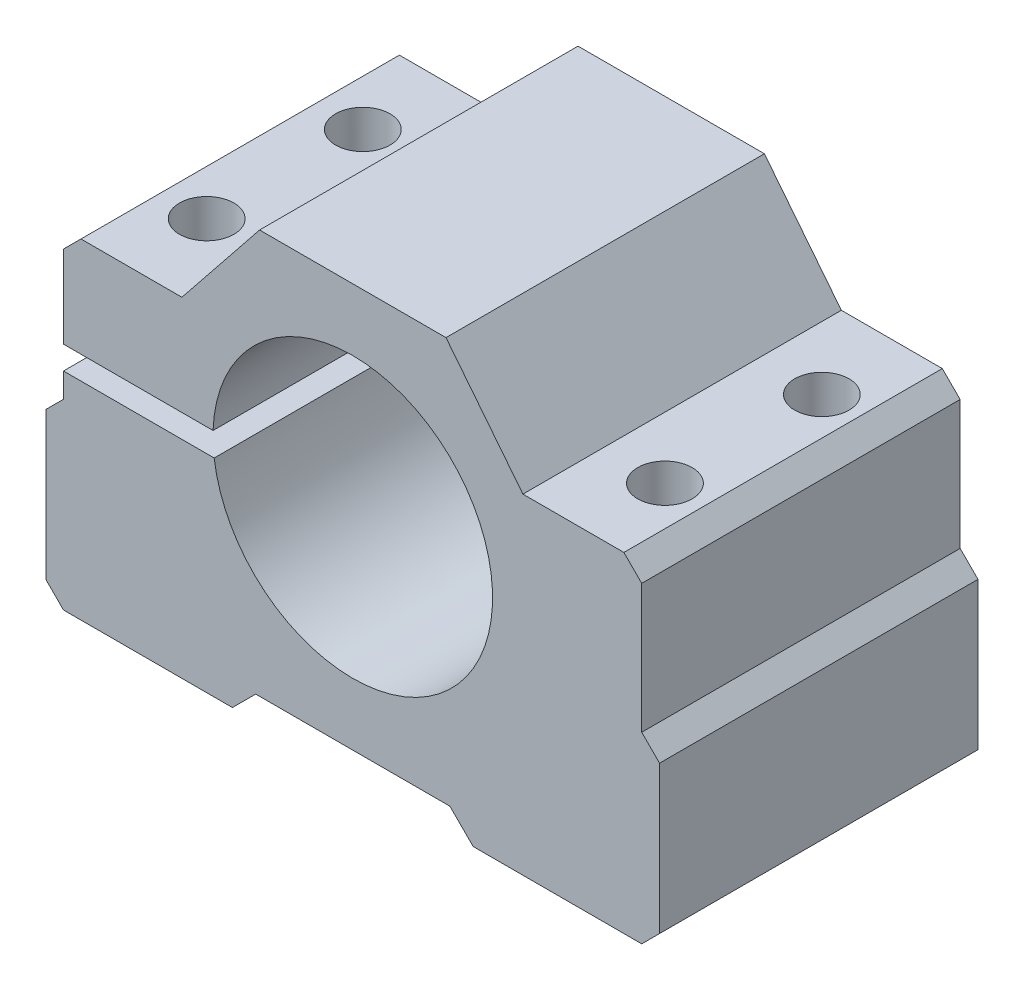
ISO-10303-21;
HEADER;
FILE_DESCRIPTION(('STEP AP214'),'2;1');
FILE_NAME('part.step','',(''),(''),'','','');
FILE_SCHEMA(('AUTOMOTIVE_DESIGN { 1 0 10303 214 1 1 1 1 }'));
ENDSEC;
DATA;
#1=APPLICATION_CONTEXT('core data for automotive mechanical design processes');
#2=APPLICATION_PROTOCOL_DEFINITION('international standard','automotive_design',2000,#1);
#3=PRODUCT_CONTEXT('',#1,'mechanical');
#4=PRODUCT('Part','Part','',(#3));
#5=PRODUCT_RELATED_PRODUCT_CATEGORY('part','',(#4));
#6=PRODUCT_DEFINITION_FORMATION('','',#4);
#7=PRODUCT_DEFINITION_CONTEXT('part definition',#1,'design');
#8=PRODUCT_DEFINITION('design','',#6,#7);
#9=PRODUCT_DEFINITION_SHAPE('','',#8);
#10=(LENGTH_UNIT() NAMED_UNIT(*) SI_UNIT(.MILLI.,.METRE.));
#11=(NAMED_UNIT(*) PLANE_ANGLE_UNIT() SI_UNIT($,.RADIAN.));
#12=(NAMED_UNIT(*) SI_UNIT($,.STERADIAN.) SOLID_ANGLE_UNIT());
#13=UNCERTAINTY_MEASURE_WITH_UNIT(LENGTH_MEASURE(1.E-05),#10,'distance_accuracy_value','');
#14=(GEOMETRIC_REPRESENTATION_CONTEXT(3) GLOBAL_UNCERTAINTY_ASSIGNED_CONTEXT((#13)) GLOBAL_UNIT_ASSIGNED_CONTEXT((#10,
#11,#12)) REPRESENTATION_CONTEXT('',''));
#15=CARTESIAN_POINT('',(0.,0.,0.));
#16=DIRECTION('',(0.,0.,1.));
#17=DIRECTION('',(1.,0.,0.));
#18=AXIS2_PLACEMENT_3D('',#15,#16,#17);
#19=CARTESIAN_POINT('',(39.5000000000198,29.,41.));
#20=DIRECTION('',(0.,0.,-1.));
#21=DIRECTION('',(-1.,0.,0.));
#22=AXIS2_PLACEMENT_3D('',#19,#20,#21);
#23=CYLINDRICAL_SURFACE('',#22,18.);
#24=CARTESIAN_POINT('',(39.5000000000198,29.,0.));
#25=DIRECTION('',(0.,0.,1.));
#26=DIRECTION('',(1.,0.,0.));
#27=AXIS2_PLACEMENT_3D('',#24,#25,#26);
#28=CIRCLE('',#27,18.);
#29=CARTESIAN_POINT('',(21.6537561687559,26.6523243164622,0.));
#30=VERTEX_POINT('',#29);
#31=CARTESIAN_POINT('',(21.5116217852036,29.646721888238,0.));
#32=VERTEX_POINT('',#31);
#33=EDGE_CURVE('E239',#30,#32,#28,.T.);
#34=ORIENTED_EDGE('',*,*,#33,.F.);
#35=DIRECTION('',(0.,0.,-1.));
#36=VECTOR('',#35,1.);
#37=CARTESIAN_POINT('',(21.6537561687559,26.6523243164622,41.));
#38=LINE('',#37,#36);
#39=CARTESIAN_POINT('',(21.6537561687559,26.6523243164622,41.));
#40=VERTEX_POINT('',#39);
#41=EDGE_CURVE('E11',#40,#30,#38,.T.);
#42=ORIENTED_EDGE('',*,*,#41,.F.);
#43=CARTESIAN_POINT('',(39.5000000000198,29.,41.));
#44=DIRECTION('',(0.,0.,1.));
#45=DIRECTION('',(1.,0.,0.));
#46=AXIS2_PLACEMENT_3D('',#43,#44,#45);
#47=CIRCLE('',#46,18.);
#48=CARTESIAN_POINT('',(21.5116217852036,29.646721888238,41.));
#49=VERTEX_POINT('',#48);
#50=EDGE_CURVE('E322',#40,#49,#47,.T.);
#51=ORIENTED_EDGE('',*,*,#50,.T.);
#52=DIRECTION('',(0.,0.,-1.));
#53=VECTOR('',#52,1.);
#54=CARTESIAN_POINT('',(21.5116217852036,29.646721888238,41.));
#55=LINE('',#54,#53);
#56=EDGE_CURVE('E145',#49,#32,#55,.T.);
#57=ORIENTED_EDGE('',*,*,#56,.T.);
#58=EDGE_LOOP('',(#34,#42,#51,#57));
#59=FACE_BOUND('',#58,.T.);
#60=ADVANCED_FACE('F43',(#59),#23,.F.);
#61=CARTESIAN_POINT('',(0.,26.6523243164623,41.));
#62=DIRECTION('',(0.,-1.,0.));
#63=DIRECTION('',(1.,0.,0.));
#64=AXIS2_PLACEMENT_3D('',#61,#62,#63);
#65=PLANE('',#64);
#66=CARTESIAN_POINT('',(10.4352501240759,26.6523243164622,10.642382920252));
#67=DIRECTION('',(0.,-1.,0.));
#68=DIRECTION('',(1.,0.,0.));
#69=AXIS2_PLACEMENT_3D('',#66,#67,#68);
#70=CIRCLE('',#69,3.50000000000001);
#71=CARTESIAN_POINT('',(13.9352501240759,26.6523243164622,10.642382920252));
#72=VERTEX_POINT('',#71);
#73=EDGE_CURVE('E406',#72,#72,#70,.T.);
#74=ORIENTED_EDGE('',*,*,#73,.T.);
#75=EDGE_LOOP('',(#74));
#76=FACE_BOUND('',#75,.T.);
#77=CARTESIAN_POINT('',(10.331990941298,26.6523243164622,30.642382920252));
#78=DIRECTION('',(0.,-1.,0.));
#79=DIRECTION('',(1.,0.,0.));
#80=AXIS2_PLACEMENT_3D('',#77,#78,#79);
#81=CIRCLE('',#80,3.50000000000001);
#82=CARTESIAN_POINT('',(13.831990941298,26.6523243164622,30.642382920252));
#83=VERTEX_POINT('',#82);
#84=EDGE_CURVE('E402',#83,#83,#81,.T.);
#85=ORIENTED_EDGE('',*,*,#84,.T.);
#86=EDGE_LOOP('',(#85));
#87=FACE_BOUND('',#86,.T.);
#88=DIRECTION('',(-1.,0.,0.));
#89=VECTOR('',#88,1.);
#90=CARTESIAN_POINT('',(0.,26.6523243164623,0.));
#91=LINE('',#90,#89);
#92=CARTESIAN_POINT('',(2.25017469417766,26.6523243164623,0.));
#93=VERTEX_POINT('',#92);
#94=EDGE_CURVE('E243',#30,#93,#91,.T.);
#95=ORIENTED_EDGE('',*,*,#94,.T.);
#96=DIRECTION('',(0.,0.,-1.));
#97=VECTOR('',#96,1.);
#98=CARTESIAN_POINT('',(2.25017469417766,26.6523243164623,41.));
#99=LINE('',#98,#97);
#100=CARTESIAN_POINT('',(2.25017469417766,26.6523243164623,41.));
#101=VERTEX_POINT('',#100);
#102=EDGE_CURVE('E53',#101,#93,#99,.T.);
#103=ORIENTED_EDGE('',*,*,#102,.F.);
#104=DIRECTION('',(-1.,0.,0.));
#105=VECTOR('',#104,1.);
#106=CARTESIAN_POINT('',(0.,26.6523243164623,41.));
#107=LINE('',#106,#105);
#108=EDGE_CURVE('E423',#40,#101,#107,.T.);
#109=ORIENTED_EDGE('',*,*,#108,.F.);
#110=ORIENTED_EDGE('',*,*,#41,.T.);
#111=EDGE_LOOP('',(#95,#103,#109,#110));
#112=FACE_BOUND('',#111,.T.);
#113=ADVANCED_FACE('F509',(#76,#87,#112),#65,.F.);
#114=CARTESIAN_POINT('',(2.25017469426138,7.06790387770834E-12,41.));
#115=DIRECTION('',(-1.,-3.14104673549731E-12,0.));
#116=DIRECTION('',(3.14104673549731E-12,-1.,0.));
#117=AXIS2_PLACEMENT_3D('',#114,#115,#116);
#118=PLANE('',#117);
#119=DIRECTION('',(-3.14104673549731E-12,1.,0.));
#120=VECTOR('',#119,1.);
#121=CARTESIAN_POINT('',(2.25017469426138,7.06790387770834E-12,0.));
#122=LINE('',#121,#120);
#123=CARTESIAN_POINT('',(2.25017469418756,23.5003493883652,0.));
#124=VERTEX_POINT('',#123);
#125=EDGE_CURVE('E247',#124,#93,#122,.T.);
#126=ORIENTED_EDGE('',*,*,#125,.F.);
#127=DIRECTION('',(0.,0.,-1.));
#128=VECTOR('',#127,1.);
#129=CARTESIAN_POINT('',(2.25017469418756,23.5003493883652,41.));
#130=LINE('',#129,#128);
#131=CARTESIAN_POINT('',(2.25017469418756,23.5003493883652,41.));
#132=VERTEX_POINT('',#131);
#133=EDGE_CURVE('E387',#132,#124,#130,.T.);
#134=ORIENTED_EDGE('',*,*,#133,.F.);
#135=DIRECTION('',(-3.14104673549731E-12,1.,0.));
#136=VECTOR('',#135,1.);
#137=CARTESIAN_POINT('',(2.25017469426138,7.06790387770834E-12,41.));
#138=LINE('',#137,#136);
#139=EDGE_CURVE('E426',#132,#101,#138,.T.);
#140=ORIENTED_EDGE('',*,*,#139,.T.);
#141=ORIENTED_EDGE('',*,*,#102,.T.);
#142=EDGE_LOOP('',(#126,#134,#140,#141));
#143=FACE_BOUND('',#142,.T.);
#144=ADVANCED_FACE('F512',(#143),#118,.T.);
#145=CARTESIAN_POINT('',(-10.6250873470888,10.6250873470888,41.));
#146=DIRECTION('',(-0.707106781186548,0.707106781186547,0.));
#147=DIRECTION('',(-0.707106781186547,-0.707106781186548,0.));
#148=AXIS2_PLACEMENT_3D('',#145,#146,#147);
#149=PLANE('',#148);
#150=DIRECTION('',(0.707106781186547,0.707106781186548,0.));
#151=VECTOR('',#150,1.);
#152=CARTESIAN_POINT('',(-10.6250873470888,10.6250873470888,0.));
#153=LINE('',#152,#151);
#154=CARTESIAN_POINT('',(0.,21.2501746941776,0.));
#155=VERTEX_POINT('',#154);
#156=EDGE_CURVE('E251',#155,#124,#153,.T.);
#157=ORIENTED_EDGE('',*,*,#156,.F.);
#158=DIRECTION('',(0.,0.,-1.));
#159=VECTOR('',#158,1.);
#160=CARTESIAN_POINT('',(0.,21.2501746941776,41.));
#161=LINE('',#160,#159);
#162=CARTESIAN_POINT('',(0.,21.2501746941776,41.));
#163=VERTEX_POINT('',#162);
#164=EDGE_CURVE('E384',#163,#155,#161,.T.);
#165=ORIENTED_EDGE('',*,*,#164,.F.);
#166=DIRECTION('',(0.707106781186547,0.707106781186548,0.));
#167=VECTOR('',#166,1.);
#168=CARTESIAN_POINT('',(-10.6250873470888,10.6250873470888,41.));
#169=LINE('',#168,#167);
#170=EDGE_CURVE('E430',#163,#132,#169,.T.);
#171=ORIENTED_EDGE('',*,*,#170,.T.);
#172=ORIENTED_EDGE('',*,*,#133,.T.);
#173=EDGE_LOOP('',(#157,#165,#171,#172));
#174=FACE_BOUND('',#173,.T.);
#175=ADVANCED_FACE('F515',(#174),#149,.T.);
#176=CARTESIAN_POINT('',(0.,0.,41.));
#177=DIRECTION('',(-1.,0.,0.));
#178=DIRECTION('',(0.,-1.,0.));
#179=AXIS2_PLACEMENT_3D('',#176,#177,#178);
#180=PLANE('',#179);
#181=DIRECTION('',(0.,1.,0.));
#182=VECTOR('',#181,1.);
#183=CARTESIAN_POINT('',(0.,0.,0.));
#184=LINE('',#183,#182);
#185=CARTESIAN_POINT('',(0.,2.25017469417764,0.));
#186=VERTEX_POINT('',#185);
#187=EDGE_CURVE('E255',#186,#155,#184,.T.);
#188=ORIENTED_EDGE('',*,*,#187,.F.);
#189=DIRECTION('',(0.,0.,-1.));
#190=VECTOR('',#189,1.);
#191=CARTESIAN_POINT('',(0.,2.25017469417764,41.));
#192=LINE('',#191,#190);
#193=CARTESIAN_POINT('',(0.,2.25017469417764,41.));
#194=VERTEX_POINT('',#193);
#195=EDGE_CURVE('E381',#194,#186,#192,.T.);
#196=ORIENTED_EDGE('',*,*,#195,.F.);
#197=DIRECTION('',(0.,1.,0.));
#198=VECTOR('',#197,1.);
#199=CARTESIAN_POINT('',(0.,0.,41.));
#200=LINE('',#199,#198);
#201=EDGE_CURVE('E434',#194,#163,#200,.T.);
#202=ORIENTED_EDGE('',*,*,#201,.T.);
#203=ORIENTED_EDGE('',*,*,#164,.T.);
#204=EDGE_LOOP('',(#188,#196,#202,#203));
#205=FACE_BOUND('',#204,.T.);
#206=ADVANCED_FACE('F520',(#205),#180,.T.);
#207=CARTESIAN_POINT('',(1.12508734708882,1.12508734708883,41.));
#208=DIRECTION('',(-0.707106781186544,-0.707106781186551,0.));
#209=DIRECTION('',(0.707106781186551,-0.707106781186544,0.));
#210=AXIS2_PLACEMENT_3D('',#207,#208,#209);
#211=PLANE('',#210);
#212=DIRECTION('',(-0.707106781186551,0.707106781186544,0.));
#213=VECTOR('',#212,1.);
#214=CARTESIAN_POINT('',(1.12508734708882,1.12508734708883,0.));
#215=LINE('',#214,#213);
#216=CARTESIAN_POINT('',(2.25017469417766,0.,0.));
#217=VERTEX_POINT('',#216);
#218=EDGE_CURVE('E259',#217,#186,#215,.T.);
#219=ORIENTED_EDGE('',*,*,#218,.F.);
#220=DIRECTION('',(0.,0.,-1.));
#221=VECTOR('',#220,1.);
#222=CARTESIAN_POINT('',(2.25017469417766,0.,41.));
#223=LINE('',#222,#221);
#224=CARTESIAN_POINT('',(2.25017469417766,0.,41.));
#225=VERTEX_POINT('',#224);
#226=EDGE_CURVE('E378',#225,#217,#223,.T.);
#227=ORIENTED_EDGE('',*,*,#226,.F.);
#228=DIRECTION('',(-0.707106781186551,0.707106781186544,0.));
#229=VECTOR('',#228,1.);
#230=CARTESIAN_POINT('',(1.12508734708882,1.12508734708883,41.));
#231=LINE('',#230,#229);
#232=EDGE_CURVE('E438',#225,#194,#231,.T.);
#233=ORIENTED_EDGE('',*,*,#232,.T.);
#234=ORIENTED_EDGE('',*,*,#195,.T.);
#235=EDGE_LOOP('',(#219,#227,#233,#234));
#236=FACE_BOUND('',#235,.T.);
#237=ADVANCED_FACE('F523',(#236),#211,.T.);
#238=CARTESIAN_POINT('',(0.,0.,41.));
#239=DIRECTION('',(0.,1.,0.));
#240=DIRECTION('',(0.,0.,1.));
#241=AXIS2_PLACEMENT_3D('',#238,#239,#240);
#242=PLANE('',#241);
#243=CARTESIAN_POINT('',(10.4352501240759,0.,10.642382920252));
#244=DIRECTION('',(0.,-1.,0.));
#245=DIRECTION('',(0.,0.,-1.));
#246=AXIS2_PLACEMENT_3D('',#243,#244,#245);
#247=CIRCLE('',#246,3.50000000000001);
#248=CARTESIAN_POINT('',(10.4352501240759,0.,7.14238292025203));
#249=VERTEX_POINT('',#248);
#250=EDGE_CURVE('E921',#249,#249,#247,.T.);
#251=ORIENTED_EDGE('',*,*,#250,.F.);
#252=EDGE_LOOP('',(#251));
#253=FACE_BOUND('',#252,.T.);
#254=CARTESIAN_POINT('',(10.331990941298,0.,30.642382920252));
#255=DIRECTION('',(0.,-1.,0.));
#256=DIRECTION('',(0.,0.,-1.));
#257=AXIS2_PLACEMENT_3D('',#254,#255,#256);
#258=CIRCLE('',#257,3.50000000000001);
#259=CARTESIAN_POINT('',(10.331990941298,0.,27.142382920252));
#260=VERTEX_POINT('',#259);
#261=EDGE_CURVE('E397',#260,#260,#258,.T.);
#262=ORIENTED_EDGE('',*,*,#261,.F.);
#263=EDGE_LOOP('',(#262));
#264=FACE_BOUND('',#263,.T.);
#265=DIRECTION('',(1.,0.,0.));
#266=VECTOR('',#265,1.);
#267=CARTESIAN_POINT('',(0.,0.,0.));
#268=LINE('',#267,#266);
#269=CARTESIAN_POINT('',(24.,0.,0.));
#270=VERTEX_POINT('',#269);
#271=EDGE_CURVE('E263',#217,#270,#268,.T.);
#272=ORIENTED_EDGE('',*,*,#271,.T.);
#273=DIRECTION('',(0.,0.,-1.));
#274=VECTOR('',#273,1.);
#275=CARTESIAN_POINT('',(24.,0.,41.));
#276=LINE('',#275,#274);
#277=CARTESIAN_POINT('',(24.,0.,41.));
#278=VERTEX_POINT('',#277);
#279=EDGE_CURVE('E374',#278,#270,#276,.T.);
#280=ORIENTED_EDGE('',*,*,#279,.F.);
#281=DIRECTION('',(1.,0.,0.));
#282=VECTOR('',#281,1.);
#283=CARTESIAN_POINT('',(0.,0.,41.));
#284=LINE('',#283,#282);
#285=EDGE_CURVE('E442',#225,#278,#284,.T.);
#286=ORIENTED_EDGE('',*,*,#285,.F.);
#287=ORIENTED_EDGE('',*,*,#226,.T.);
#288=EDGE_LOOP('',(#272,#280,#286,#287));
#289=FACE_BOUND('',#288,.T.);
#290=ADVANCED_FACE('F529',(#253,#264,#289),#242,.F.);
#291=CARTESIAN_POINT('',(12.,-12.,41.));
#292=DIRECTION('',(-0.707106781186546,0.707106781186549,0.));
#293=DIRECTION('',(-0.707106781186549,-0.707106781186546,0.));
#294=AXIS2_PLACEMENT_3D('',#291,#292,#293);
#295=PLANE('',#294);
#296=DIRECTION('',(0.707106781186549,0.707106781186546,0.));
#297=VECTOR('',#296,1.);
#298=CARTESIAN_POINT('',(12.,-12.,0.));
#299=LINE('',#298,#297);
#300=CARTESIAN_POINT('',(26.9999999999868,2.9999999999868,0.));
#301=VERTEX_POINT('',#300);
#302=EDGE_CURVE('E266',#270,#301,#299,.T.);
#303=ORIENTED_EDGE('',*,*,#302,.T.);
#304=DIRECTION('',(0.,0.,-1.));
#305=VECTOR('',#304,1.);
#306=CARTESIAN_POINT('',(26.9999999999868,2.9999999999868,41.));
#307=LINE('',#306,#305);
#308=CARTESIAN_POINT('',(26.9999999999868,2.9999999999868,41.));
#309=VERTEX_POINT('',#308);
#310=EDGE_CURVE('E370',#309,#301,#307,.T.);
#311=ORIENTED_EDGE('',*,*,#310,.F.);
#312=DIRECTION('',(0.707106781186549,0.707106781186546,0.));
#313=VECTOR('',#312,1.);
#314=CARTESIAN_POINT('',(12.,-12.,41.));
#315=LINE('',#314,#313);
#316=EDGE_CURVE('E445',#278,#309,#315,.T.);
#317=ORIENTED_EDGE('',*,*,#316,.F.);
#318=ORIENTED_EDGE('',*,*,#279,.T.);
#319=EDGE_LOOP('',(#303,#311,#317,#318));
#320=FACE_BOUND('',#319,.T.);
#321=ADVANCED_FACE('F533',(#320),#295,.F.);
#322=CARTESIAN_POINT('',(0.,2.9999999999868,41.));
#323=DIRECTION('',(0.,1.,0.));
#324=DIRECTION('',(0.,0.,1.));
#325=AXIS2_PLACEMENT_3D('',#322,#323,#324);
#326=PLANE('',#325);
#327=DIRECTION('',(1.,0.,0.));
#328=VECTOR('',#327,1.);
#329=CARTESIAN_POINT('',(0.,2.9999999999868,0.));
#330=LINE('',#329,#328);
#331=CARTESIAN_POINT('',(52.0000000000528,2.9999999999868,0.));
#332=VERTEX_POINT('',#331);
#333=EDGE_CURVE('E269',#301,#332,#330,.T.);
#334=ORIENTED_EDGE('',*,*,#333,.T.);
#335=DIRECTION('',(0.,0.,-1.));
#336=VECTOR('',#335,1.);
#337=CARTESIAN_POINT('',(52.0000000000528,2.9999999999868,41.));
#338=LINE('',#337,#336);
#339=CARTESIAN_POINT('',(52.0000000000528,2.9999999999868,41.));
#340=VERTEX_POINT('',#339);
#341=EDGE_CURVE('E367',#340,#332,#338,.T.);
#342=ORIENTED_EDGE('',*,*,#341,.F.);
#343=DIRECTION('',(1.,0.,0.));
#344=VECTOR('',#343,1.);
#345=CARTESIAN_POINT('',(0.,2.9999999999868,41.));
#346=LINE('',#345,#344);
#347=EDGE_CURVE('E448',#309,#340,#346,.T.);
#348=ORIENTED_EDGE('',*,*,#347,.F.);
#349=ORIENTED_EDGE('',*,*,#310,.T.);
#350=EDGE_LOOP('',(#334,#342,#348,#349));
#351=FACE_BOUND('',#350,.T.);
#352=ADVANCED_FACE('F538',(#351),#326,.F.);
#353=CARTESIAN_POINT('',(27.5000000000198,27.5000000000198,41.));
#354=DIRECTION('',(-0.707106781186547,-0.707106781186547,0.));
#355=DIRECTION('',(0.707106781186548,-0.707106781186548,0.));
#356=AXIS2_PLACEMENT_3D('',#353,#354,#355);
#357=PLANE('',#356);
#358=DIRECTION('',(-0.707106781186548,0.707106781186548,0.));
#359=VECTOR('',#358,1.);
#360=CARTESIAN_POINT('',(27.5000000000198,27.5000000000198,0.));
#361=LINE('',#360,#359);
#362=CARTESIAN_POINT('',(55.0000000000528,-1.32218879854023E-11,0.));
#363=VERTEX_POINT('',#362);
#364=EDGE_CURVE('E273',#363,#332,#361,.T.);
#365=ORIENTED_EDGE('',*,*,#364,.F.);
#366=DIRECTION('',(0.,0.,-1.));
#367=VECTOR('',#366,1.);
#368=CARTESIAN_POINT('',(55.0000000000528,-1.32218879854023E-11,41.));
#369=LINE('',#368,#367);
#370=CARTESIAN_POINT('',(55.0000000000528,-1.32218879854023E-11,41.));
#371=VERTEX_POINT('',#370);
#372=EDGE_CURVE('E364',#371,#363,#369,.T.);
#373=ORIENTED_EDGE('',*,*,#372,.F.);
#374=DIRECTION('',(-0.707106781186548,0.707106781186548,0.));
#375=VECTOR('',#374,1.);
#376=CARTESIAN_POINT('',(27.5000000000198,27.5000000000198,41.));
#377=LINE('',#376,#375);
#378=EDGE_CURVE('E451',#371,#340,#377,.T.);
#379=ORIENTED_EDGE('',*,*,#378,.T.);
#380=ORIENTED_EDGE('',*,*,#341,.T.);
#381=EDGE_LOOP('',(#365,#373,#379,#380));
#382=FACE_BOUND('',#381,.T.);
#383=ADVANCED_FACE('F544',(#382),#357,.T.);
#384=CARTESIAN_POINT('',(0.,-1.32218879854023E-11,41.));
#385=DIRECTION('',(0.,1.,0.));
#386=DIRECTION('',(0.,0.,1.));
#387=AXIS2_PLACEMENT_3D('',#384,#385,#386);
#388=PLANE('',#387);
#389=CARTESIAN_POINT('',(69.5385093068539,0.,10.642382920252));
#390=DIRECTION('',(0.,-1.,0.));
#391=DIRECTION('',(0.,0.,-1.));
#392=AXIS2_PLACEMENT_3D('',#389,#390,#391);
#393=CIRCLE('',#392,3.50000000000002);
#394=CARTESIAN_POINT('',(69.5385093068539,0.,7.14238292025202));
#395=VERTEX_POINT('',#394);
#396=EDGE_CURVE('E923',#395,#395,#393,.T.);
#397=ORIENTED_EDGE('',*,*,#396,.F.);
#398=EDGE_LOOP('',(#397));
#399=FACE_BOUND('',#398,.T.);
#400=CARTESIAN_POINT('',(69.3319909412979,0.,30.642382920252));
#401=DIRECTION('',(0.,-1.,0.));
#402=DIRECTION('',(0.,0.,-1.));
#403=AXIS2_PLACEMENT_3D('',#400,#401,#402);
#404=CIRCLE('',#403,3.50000000000002);
#405=CARTESIAN_POINT('',(69.3319909412979,0.,27.142382920252));
#406=VERTEX_POINT('',#405);
#407=EDGE_CURVE('E927',#406,#406,#404,.T.);
#408=ORIENTED_EDGE('',*,*,#407,.F.);
#409=EDGE_LOOP('',(#408));
#410=FACE_BOUND('',#409,.T.);
#411=DIRECTION('',(1.,0.,0.));
#412=VECTOR('',#411,1.);
#413=CARTESIAN_POINT('',(0.,-1.32218879854023E-11,0.));
#414=LINE('',#413,#412);
#415=CARTESIAN_POINT('',(76.7029404499271,-1.32218879854023E-11,0.));
#416=VERTEX_POINT('',#415);
#417=EDGE_CURVE('E277',#363,#416,#414,.T.);
#418=ORIENTED_EDGE('',*,*,#417,.T.);
#419=DIRECTION('',(0.,0.,-1.));
#420=VECTOR('',#419,1.);
#421=CARTESIAN_POINT('',(76.7029404499271,-1.32218879854023E-11,41.));
#422=LINE('',#421,#420);
#423=CARTESIAN_POINT('',(76.7029404499271,-1.32218879854023E-11,41.));
#424=VERTEX_POINT('',#423);
#425=EDGE_CURVE('E360',#424,#416,#422,.T.);
#426=ORIENTED_EDGE('',*,*,#425,.F.);
#427=DIRECTION('',(1.,0.,0.));
#428=VECTOR('',#427,1.);
#429=CARTESIAN_POINT('',(0.,-1.32218879854023E-11,41.));
#430=LINE('',#429,#428);
#431=EDGE_CURVE('E455',#371,#424,#430,.T.);
#432=ORIENTED_EDGE('',*,*,#431,.F.);
#433=ORIENTED_EDGE('',*,*,#372,.T.);
#434=EDGE_LOOP('',(#418,#426,#432,#433));
#435=FACE_BOUND('',#434,.T.);
#436=ADVANCED_FACE('F547',(#399,#410,#435),#388,.F.);
#437=CARTESIAN_POINT('',(38.3514702249702,-38.3514702249701,41.));
#438=DIRECTION('',(-0.707106781186548,0.707106781186547,0.));
#439=DIRECTION('',(-0.707106781186547,-0.707106781186548,0.));
#440=AXIS2_PLACEMENT_3D('',#437,#438,#439);
#441=PLANE('',#440);
#442=DIRECTION('',(0.707106781186547,0.707106781186548,0.));
#443=VECTOR('',#442,1.);
#444=CARTESIAN_POINT('',(38.3514702249702,-38.3514702249701,0.));
#445=LINE('',#444,#443);
#446=CARTESIAN_POINT('',(79.0000000000223,2.29705955008204,0.));
#447=VERTEX_POINT('',#446);
#448=EDGE_CURVE('E280',#416,#447,#445,.T.);
#449=ORIENTED_EDGE('',*,*,#448,.T.);
#450=DIRECTION('',(0.,0.,-1.));
#451=VECTOR('',#450,1.);
#452=CARTESIAN_POINT('',(79.0000000000223,2.29705955008204,41.));
#453=LINE('',#452,#451);
#454=CARTESIAN_POINT('',(79.0000000000223,2.29705955008204,41.));
#455=VERTEX_POINT('',#454);
#456=EDGE_CURVE('E356',#455,#447,#453,.T.);
#457=ORIENTED_EDGE('',*,*,#456,.F.);
#458=DIRECTION('',(0.707106781186547,0.707106781186548,0.));
#459=VECTOR('',#458,1.);
#460=CARTESIAN_POINT('',(38.3514702249702,-38.3514702249701,41.));
#461=LINE('',#460,#459);
#462=EDGE_CURVE('E458',#424,#455,#461,.T.);
#463=ORIENTED_EDGE('',*,*,#462,.F.);
#464=ORIENTED_EDGE('',*,*,#425,.T.);
#465=EDGE_LOOP('',(#449,#457,#463,#464));
#466=FACE_BOUND('',#465,.T.);
#467=ADVANCED_FACE('F552',(#466),#441,.F.);
#468=CARTESIAN_POINT('',(79.0000000000223,0.,41.));
#469=DIRECTION('',(-1.,0.,0.));
#470=DIRECTION('',(0.,0.,1.));
#471=AXIS2_PLACEMENT_3D('',#468,#469,#470);
#472=PLANE('',#471);
#473=DIRECTION('',(0.,1.,0.));
#474=VECTOR('',#473,1.);
#475=CARTESIAN_POINT('',(79.0000000000223,0.,0.));
#476=LINE('',#475,#474);
#477=CARTESIAN_POINT('',(79.0000000000223,21.297059550082,0.));
#478=VERTEX_POINT('',#477);
#479=EDGE_CURVE('E283',#447,#478,#476,.T.);
#480=ORIENTED_EDGE('',*,*,#479,.T.);
#481=DIRECTION('',(0.,0.,-1.));
#482=VECTOR('',#481,1.);
#483=CARTESIAN_POINT('',(79.0000000000223,21.297059550082,41.));
#484=LINE('',#483,#482);
#485=CARTESIAN_POINT('',(79.0000000000223,21.297059550082,41.));
#486=VERTEX_POINT('',#485);
#487=EDGE_CURVE('E352',#486,#478,#484,.T.);
#488=ORIENTED_EDGE('',*,*,#487,.F.);
#489=DIRECTION('',(0.,1.,0.));
#490=VECTOR('',#489,1.);
#491=CARTESIAN_POINT('',(79.0000000000223,0.,41.));
#492=LINE('',#491,#490);
#493=EDGE_CURVE('E461',#455,#486,#492,.T.);
#494=ORIENTED_EDGE('',*,*,#493,.F.);
#495=ORIENTED_EDGE('',*,*,#456,.T.);
#496=EDGE_LOOP('',(#480,#488,#494,#495));
#497=FACE_BOUND('',#496,.T.);
#498=ADVANCED_FACE('F558',(#497),#472,.F.);
#499=CARTESIAN_POINT('',(50.148529775165,50.1485297750218,41.));
#500=DIRECTION('',(-0.707106781187557,-0.707106781185538,0.));
#501=DIRECTION('',(0.707106781185538,-0.707106781187557,0.));
#502=AXIS2_PLACEMENT_3D('',#499,#500,#501);
#503=PLANE('',#502);
#504=DIRECTION('',(-0.707106781185538,0.707106781187557,0.));
#505=VECTOR('',#504,1.);
#506=CARTESIAN_POINT('',(50.148529775165,50.1485297750218,0.));
#507=LINE('',#506,#505);
#508=CARTESIAN_POINT('',(76.7029404499245,23.5941191001864,0.));
#509=VERTEX_POINT('',#508);
#510=EDGE_CURVE('E286',#478,#509,#507,.T.);
#511=ORIENTED_EDGE('',*,*,#510,.T.);
#512=DIRECTION('',(0.,0.,-1.));
#513=VECTOR('',#512,1.);
#514=CARTESIAN_POINT('',(76.7029404499245,23.5941191001864,41.));
#515=LINE('',#514,#513);
#516=CARTESIAN_POINT('',(76.7029404499245,23.5941191001864,41.));
#517=VERTEX_POINT('',#516);
#518=EDGE_CURVE('E348',#517,#509,#515,.T.);
#519=ORIENTED_EDGE('',*,*,#518,.F.);
#520=DIRECTION('',(-0.707106781185538,0.707106781187557,0.));
#521=VECTOR('',#520,1.);
#522=CARTESIAN_POINT('',(50.148529775165,50.1485297750218,41.));
#523=LINE('',#522,#521);
#524=EDGE_CURVE('E464',#486,#517,#523,.T.);
#525=ORIENTED_EDGE('',*,*,#524,.F.);
#526=ORIENTED_EDGE('',*,*,#487,.T.);
#527=EDGE_LOOP('',(#511,#519,#525,#526));
#528=FACE_BOUND('',#527,.T.);
#529=ADVANCED_FACE('F562',(#528),#503,.F.);
#530=CARTESIAN_POINT('',(76.7029404499245,0.,41.));
#531=DIRECTION('',(-1.,0.,0.));
#532=DIRECTION('',(0.,-1.,0.));
#533=AXIS2_PLACEMENT_3D('',#530,#531,#532);
#534=PLANE('',#533);
#535=DIRECTION('',(0.,1.,0.));
#536=VECTOR('',#535,1.);
#537=CARTESIAN_POINT('',(76.7029404499245,0.,0.));
#538=LINE('',#537,#536);
#539=CARTESIAN_POINT('',(76.7029404499245,40.2029404498859,0.));
#540=VERTEX_POINT('',#539);
#541=EDGE_CURVE('E289',#509,#540,#538,.T.);
#542=ORIENTED_EDGE('',*,*,#541,.T.);
#543=DIRECTION('',(0.,0.,-1.));
#544=VECTOR('',#543,1.);
#545=CARTESIAN_POINT('',(76.7029404499245,40.2029404498859,41.));
#546=LINE('',#545,#544);
#547=CARTESIAN_POINT('',(76.7029404499245,40.2029404498859,41.));
#548=VERTEX_POINT('',#547);
#549=EDGE_CURVE('E345',#548,#540,#546,.T.);
#550=ORIENTED_EDGE('',*,*,#549,.F.);
#551=DIRECTION('',(0.,1.,0.));
#552=VECTOR('',#551,1.);
#553=CARTESIAN_POINT('',(76.7029404499245,0.,41.));
#554=LINE('',#553,#552);
#555=EDGE_CURVE('E467',#517,#548,#554,.T.);
#556=ORIENTED_EDGE('',*,*,#555,.F.);
#557=ORIENTED_EDGE('',*,*,#518,.T.);
#558=EDGE_LOOP('',(#542,#550,#556,#557));
#559=FACE_BOUND('',#558,.T.);
#560=ADVANCED_FACE('F567',(#559),#534,.F.);
#561=CARTESIAN_POINT('',(58.452940449905,58.4529404499053,41.));
#562=DIRECTION('',(0.707106781186545,0.70710678118655,0.));
#563=DIRECTION('',(-0.70710678118655,0.707106781186545,0.));
#564=AXIS2_PLACEMENT_3D('',#561,#562,#563);
#565=PLANE('',#564);
#566=DIRECTION('',(0.70710678118655,-0.707106781186545,0.));
#567=VECTOR('',#566,1.);
#568=CARTESIAN_POINT('',(58.452940449905,58.4529404499053,0.));
#569=LINE('',#568,#567);
#570=CARTESIAN_POINT('',(74.4058808998105,42.5,0.));
#571=VERTEX_POINT('',#570);
#572=EDGE_CURVE('E293',#571,#540,#569,.T.);
#573=ORIENTED_EDGE('',*,*,#572,.F.);
#574=DIRECTION('',(0.,0.,-1.));
#575=VECTOR('',#574,1.);
#576=CARTESIAN_POINT('',(74.4058808998105,42.5,41.));
#577=LINE('',#576,#575);
#578=CARTESIAN_POINT('',(74.4058808998105,42.5,41.));
#579=VERTEX_POINT('',#578);
#580=EDGE_CURVE('E342',#579,#571,#577,.T.);
#581=ORIENTED_EDGE('',*,*,#580,.F.);
#582=DIRECTION('',(0.70710678118655,-0.707106781186545,0.));
#583=VECTOR('',#582,1.);
#584=CARTESIAN_POINT('',(58.452940449905,58.4529404499053,41.));
#585=LINE('',#584,#583);
#586=EDGE_CURVE('E470',#579,#548,#585,.T.);
#587=ORIENTED_EDGE('',*,*,#586,.T.);
#588=ORIENTED_EDGE('',*,*,#549,.T.);
#589=EDGE_LOOP('',(#573,#581,#587,#588));
#590=FACE_BOUND('',#589,.T.);
#591=ADVANCED_FACE('F581',(#590),#565,.T.);
#592=CARTESIAN_POINT('',(0.,42.5,41.));
#593=DIRECTION('',(0.,1.,0.));
#594=DIRECTION('',(0.,0.,1.));
#595=AXIS2_PLACEMENT_3D('',#592,#593,#594);
#596=PLANE('',#595);
#597=CARTESIAN_POINT('',(69.5385093068539,42.5,10.642382920252));
#598=DIRECTION('',(0.,1.,0.));
#599=DIRECTION('',(0.,0.,1.));
#600=AXIS2_PLACEMENT_3D('',#597,#598,#599);
#601=CIRCLE('',#600,3.50000000000002);
#602=CARTESIAN_POINT('',(69.5385093068539,42.5,14.1423829202521));
#603=VERTEX_POINT('',#602);
#604=EDGE_CURVE('E46',#603,#603,#601,.T.);
#605=ORIENTED_EDGE('',*,*,#604,.F.);
#606=EDGE_LOOP('',(#605));
#607=FACE_BOUND('',#606,.T.);
#608=CARTESIAN_POINT('',(69.3319909412979,42.5,30.642382920252));
#609=DIRECTION('',(0.,1.,0.));
#610=DIRECTION('',(0.,0.,1.));
#611=AXIS2_PLACEMENT_3D('',#608,#609,#610);
#612=CIRCLE('',#611,3.50000000000002);
#613=CARTESIAN_POINT('',(69.3319909412979,42.5,34.1423829202521));
#614=VERTEX_POINT('',#613);
#615=EDGE_CURVE('E403',#614,#614,#612,.T.);
#616=ORIENTED_EDGE('',*,*,#615,.F.);
#617=EDGE_LOOP('',(#616));
#618=FACE_BOUND('',#617,.T.);
#619=DIRECTION('',(1.,0.,0.));
#620=VECTOR('',#619,1.);
#621=CARTESIAN_POINT('',(0.,42.5,0.));
#622=LINE('',#621,#620);
#623=CARTESIAN_POINT('',(61.4058808998105,42.5,0.));
#624=VERTEX_POINT('',#623);
#625=EDGE_CURVE('E297',#624,#571,#622,.T.);
#626=ORIENTED_EDGE('',*,*,#625,.F.);
#627=DIRECTION('',(0.,0.,-1.));
#628=VECTOR('',#627,1.);
#629=CARTESIAN_POINT('',(61.4058808998105,42.5,41.));
#630=LINE('',#629,#628);
#631=CARTESIAN_POINT('',(61.4058808998105,42.5,41.));
#632=VERTEX_POINT('',#631);
#633=EDGE_CURVE('E339',#632,#624,#630,.T.);
#634=ORIENTED_EDGE('',*,*,#633,.F.);
#635=DIRECTION('',(1.,0.,0.));
#636=VECTOR('',#635,1.);
#637=CARTESIAN_POINT('',(0.,42.5,41.));
#638=LINE('',#637,#636);
#639=EDGE_CURVE('E474',#632,#579,#638,.T.);
#640=ORIENTED_EDGE('',*,*,#639,.T.);
#641=ORIENTED_EDGE('',*,*,#580,.T.);
#642=EDGE_LOOP('',(#626,#634,#640,#641));
#643=FACE_BOUND('',#642,.T.);
#644=ADVANCED_FACE('F573',(#607,#618,#643),#596,.T.);
#645=CARTESIAN_POINT('',(58.4062187228263,46.2852037180353,41.));
#646=DIRECTION('',(0.78373914610705,0.621090131027206,0.));
#647=DIRECTION('',(-0.621090131027206,0.78373914610705,0.));
#648=AXIS2_PLACEMENT_3D('',#645,#646,#647);
#649=PLANE('',#648);
#650=DIRECTION('',(0.621090131027206,-0.78373914610705,0.));
#651=VECTOR('',#650,1.);
#652=CARTESIAN_POINT('',(58.4062187228263,46.2852037180353,0.));
#653=LINE('',#652,#651);
#654=CARTESIAN_POINT('',(51.5000000000198,55.,0.));
#655=VERTEX_POINT('',#654);
#656=EDGE_CURVE('E301',#655,#624,#653,.T.);
#657=ORIENTED_EDGE('',*,*,#656,.F.);
#658=DIRECTION('',(0.,0.,-1.));
#659=VECTOR('',#658,1.);
#660=CARTESIAN_POINT('',(51.5000000000198,55.,41.));
#661=LINE('',#660,#659);
#662=CARTESIAN_POINT('',(51.5000000000198,55.,41.));
#663=VERTEX_POINT('',#662);
#664=EDGE_CURVE('E336',#663,#655,#661,.T.);
#665=ORIENTED_EDGE('',*,*,#664,.F.);
#666=DIRECTION('',(0.621090131027206,-0.78373914610705,0.));
#667=VECTOR('',#666,1.);
#668=CARTESIAN_POINT('',(58.4062187228263,46.2852037180353,41.));
#669=LINE('',#668,#667);
#670=EDGE_CURVE('E478',#663,#632,#669,.T.);
#671=ORIENTED_EDGE('',*,*,#670,.T.);
#672=ORIENTED_EDGE('',*,*,#633,.T.);
#673=EDGE_LOOP('',(#657,#665,#671,#672));
#674=FACE_BOUND('',#673,.T.);
#675=ADVANCED_FACE('F577',(#674),#649,.T.);
#676=CARTESIAN_POINT('',(0.,55.,41.));
#677=DIRECTION('',(0.,1.,0.));
#678=DIRECTION('',(-1.,0.,0.));
#679=AXIS2_PLACEMENT_3D('',#676,#677,#678);
#680=PLANE('',#679);
#681=DIRECTION('',(1.,0.,0.));
#682=VECTOR('',#681,1.);
#683=CARTESIAN_POINT('',(0.,55.,0.));
#684=LINE('',#683,#682);
#685=CARTESIAN_POINT('',(27.5000000000198,55.,0.));
#686=VERTEX_POINT('',#685);
#687=EDGE_CURVE('E305',#686,#655,#684,.T.);
#688=ORIENTED_EDGE('',*,*,#687,.F.);
#689=DIRECTION('',(0.,0.,-1.));
#690=VECTOR('',#689,1.);
#691=CARTESIAN_POINT('',(27.5000000000198,55.,41.));
#692=LINE('',#691,#690);
#693=CARTESIAN_POINT('',(27.5000000000198,55.,41.));
#694=VERTEX_POINT('',#693);
#695=EDGE_CURVE('E333',#694,#686,#692,.T.);
#696=ORIENTED_EDGE('',*,*,#695,.F.);
#697=DIRECTION('',(1.,0.,0.));
#698=VECTOR('',#697,1.);
#699=CARTESIAN_POINT('',(0.,55.,41.));
#700=LINE('',#699,#698);
#701=EDGE_CURVE('E482',#694,#663,#700,.T.);
#702=ORIENTED_EDGE('',*,*,#701,.T.);
#703=ORIENTED_EDGE('',*,*,#664,.T.);
#704=EDGE_LOOP('',(#688,#696,#702,#703));
#705=FACE_BOUND('',#704,.T.);
#706=ADVANCED_FACE('F580',(#705),#680,.T.);
#707=CARTESIAN_POINT('',(-10.060312559593,8.04796885118968,41.));
#708=DIRECTION('',(0.780879456361381,-0.624681738673987,0.));
#709=DIRECTION('',(0.624681738673987,0.78087945636138,0.));
#710=AXIS2_PLACEMENT_3D('',#707,#708,#709);
#711=PLANE('',#710);
#712=DIRECTION('',(-0.624681738673987,-0.78087945636138,0.));
#713=VECTOR('',#712,1.);
#714=CARTESIAN_POINT('',(-10.060312559593,8.04796885118968,0.));
#715=LINE('',#714,#713);
#716=CARTESIAN_POINT('',(17.5003493883751,42.5,0.));
#717=VERTEX_POINT('',#716);
#718=EDGE_CURVE('E309',#686,#717,#715,.T.);
#719=ORIENTED_EDGE('',*,*,#718,.T.);
#720=DIRECTION('',(0.,0.,-1.));
#721=VECTOR('',#720,1.);
#722=CARTESIAN_POINT('',(17.5003493883751,42.5,41.));
#723=LINE('',#722,#721);
#724=CARTESIAN_POINT('',(17.5003493883751,42.5,41.));
#725=VERTEX_POINT('',#724);
#726=EDGE_CURVE('E329',#725,#717,#723,.T.);
#727=ORIENTED_EDGE('',*,*,#726,.F.);
#728=DIRECTION('',(-0.624681738673987,-0.78087945636138,0.));
#729=VECTOR('',#728,1.);
#730=CARTESIAN_POINT('',(-10.060312559593,8.04796885118968,41.));
#731=LINE('',#730,#729);
#732=EDGE_CURVE('E486',#694,#725,#731,.T.);
#733=ORIENTED_EDGE('',*,*,#732,.F.);
#734=ORIENTED_EDGE('',*,*,#695,.T.);
#735=EDGE_LOOP('',(#719,#727,#733,#734));
#736=FACE_BOUND('',#735,.T.);
#737=ADVANCED_FACE('F494',(#736),#711,.F.);
#738=CARTESIAN_POINT('',(0.,42.5,41.));
#739=DIRECTION('',(0.,-1.,0.));
#740=DIRECTION('',(0.,0.,-1.));
#741=AXIS2_PLACEMENT_3D('',#738,#739,#740);
#742=PLANE('',#741);
#743=CARTESIAN_POINT('',(10.4352501240759,42.5,10.642382920252));
#744=DIRECTION('',(0.,-1.,0.));
#745=DIRECTION('',(0.,0.,-1.));
#746=AXIS2_PLACEMENT_3D('',#743,#744,#745);
#747=CIRCLE('',#746,3.50000000000001);
#748=CARTESIAN_POINT('',(10.4352501240759,42.5,7.14238292025203));
#749=VERTEX_POINT('',#748);
#750=EDGE_CURVE('E401',#749,#749,#747,.T.);
#751=ORIENTED_EDGE('',*,*,#750,.T.);
#752=EDGE_LOOP('',(#751));
#753=FACE_BOUND('',#752,.T.);
#754=CARTESIAN_POINT('',(10.331990941298,42.5,30.642382920252));
#755=DIRECTION('',(0.,-1.,0.));
#756=DIRECTION('',(0.,0.,-1.));
#757=AXIS2_PLACEMENT_3D('',#754,#755,#756);
#758=CIRCLE('',#757,3.50000000000001);
#759=CARTESIAN_POINT('',(10.331990941298,42.5,27.142382920252));
#760=VERTEX_POINT('',#759);
#761=EDGE_CURVE('E396',#760,#760,#758,.T.);
#762=ORIENTED_EDGE('',*,*,#761,.T.);
#763=EDGE_LOOP('',(#762));
#764=FACE_BOUND('',#763,.T.);
#765=DIRECTION('',(-1.,0.,0.));
#766=VECTOR('',#765,1.);
#767=CARTESIAN_POINT('',(0.,42.5,0.));
#768=LINE('',#767,#766);
#769=CARTESIAN_POINT('',(4.50034938837512,42.5,0.));
#770=VERTEX_POINT('',#769);
#771=EDGE_CURVE('E312',#717,#770,#768,.T.);
#772=ORIENTED_EDGE('',*,*,#771,.T.);
#773=DIRECTION('',(0.,0.,-1.));
#774=VECTOR('',#773,1.);
#775=CARTESIAN_POINT('',(4.50034938837512,42.5,41.));
#776=LINE('',#775,#774);
#777=CARTESIAN_POINT('',(4.50034938837512,42.5,41.));
#778=VERTEX_POINT('',#777);
#779=EDGE_CURVE('E229',#778,#770,#776,.T.);
#780=ORIENTED_EDGE('',*,*,#779,.F.);
#781=DIRECTION('',(-1.,0.,0.));
#782=VECTOR('',#781,1.);
#783=CARTESIAN_POINT('',(0.,42.5,41.));
#784=LINE('',#783,#782);
#785=EDGE_CURVE('E218',#725,#778,#784,.T.);
#786=ORIENTED_EDGE('',*,*,#785,.F.);
#787=ORIENTED_EDGE('',*,*,#726,.T.);
#788=EDGE_LOOP('',(#772,#780,#786,#787));
#789=FACE_BOUND('',#788,.T.);
#790=ADVANCED_FACE('F498',(#753,#764,#789),#742,.F.);
#791=CARTESIAN_POINT('',(-18.9998253058125,18.9998253058127,41.));
#792=DIRECTION('',(0.707106781186543,-0.707106781186552,0.));
#793=DIRECTION('',(0.707106781186552,0.707106781186543,0.));
#794=AXIS2_PLACEMENT_3D('',#791,#792,#793);
#795=PLANE('',#794);
#796=DIRECTION('',(-0.707106781186552,-0.707106781186543,0.));
#797=VECTOR('',#796,1.);
#798=CARTESIAN_POINT('',(-18.9998253058125,18.9998253058127,0.));
#799=LINE('',#798,#797);
#800=CARTESIAN_POINT('',(2.25017469418756,40.2498253058124,0.));
#801=VERTEX_POINT('',#800);
#802=EDGE_CURVE('E227',#770,#801,#799,.T.);
#803=ORIENTED_EDGE('',*,*,#802,.T.);
#804=DIRECTION('',(0.,0.,-1.));
#805=VECTOR('',#804,1.);
#806=CARTESIAN_POINT('',(2.25017469418756,40.2498253058124,41.));
#807=LINE('',#806,#805);
#808=CARTESIAN_POINT('',(2.25017469418756,40.2498253058124,41.));
#809=VERTEX_POINT('',#808);
#810=EDGE_CURVE('E224',#809,#801,#807,.T.);
#811=ORIENTED_EDGE('',*,*,#810,.F.);
#812=DIRECTION('',(-0.707106781186552,-0.707106781186543,0.));
#813=VECTOR('',#812,1.);
#814=CARTESIAN_POINT('',(-18.9998253058125,18.9998253058127,41.));
#815=LINE('',#814,#813);
#816=EDGE_CURVE('E212',#778,#809,#815,.T.);
#817=ORIENTED_EDGE('',*,*,#816,.F.);
#818=ORIENTED_EDGE('',*,*,#779,.T.);
#819=EDGE_LOOP('',(#803,#811,#817,#818));
#820=FACE_BOUND('',#819,.T.);
#821=ADVANCED_FACE('F225',(#820),#795,.F.);
#822=CARTESIAN_POINT('',(2.25017469414999,-2.10051715919492E-12,41.));
#823=DIRECTION('',(1.,-9.33490703924392E-13,0.));
#824=DIRECTION('',(9.33490703924392E-13,1.,0.));
#825=AXIS2_PLACEMENT_3D('',#822,#823,#824);
#826=PLANE('',#825);
#827=DIRECTION('',(-9.33490703924392E-13,-1.,0.));
#828=VECTOR('',#827,1.);
#829=CARTESIAN_POINT('',(2.25017469414999,-2.10051715919492E-12,0.));
#830=LINE('',#829,#828);
#831=CARTESIAN_POINT('',(2.25017469417766,29.646721888238,0.));
#832=VERTEX_POINT('',#831);
#833=EDGE_CURVE('E138',#801,#832,#830,.T.);
#834=ORIENTED_EDGE('',*,*,#833,.T.);
#835=DIRECTION('',(0.,0.,-1.));
#836=VECTOR('',#835,1.);
#837=CARTESIAN_POINT('',(2.25017469417766,29.646721888238,41.));
#838=LINE('',#837,#836);
#839=CARTESIAN_POINT('',(2.25017469417766,29.646721888238,41.));
#840=VERTEX_POINT('',#839);
#841=EDGE_CURVE('E230',#840,#832,#838,.T.);
#842=ORIENTED_EDGE('',*,*,#841,.F.);
#843=DIRECTION('',(-9.33490703924392E-13,-1.,0.));
#844=VECTOR('',#843,1.);
#845=CARTESIAN_POINT('',(2.25017469414999,-2.10051715919492E-12,41.));
#846=LINE('',#845,#844);
#847=EDGE_CURVE('E216',#809,#840,#846,.T.);
#848=ORIENTED_EDGE('',*,*,#847,.F.);
#849=ORIENTED_EDGE('',*,*,#810,.T.);
#850=EDGE_LOOP('',(#834,#842,#848,#849));
#851=FACE_BOUND('',#850,.T.);
#852=ADVANCED_FACE('F232',(#851),#826,.F.);
#853=CARTESIAN_POINT('',(0.,29.646721888238,41.));
#854=DIRECTION('',(0.,1.,0.));
#855=DIRECTION('',(-1.,0.,0.));
#856=AXIS2_PLACEMENT_3D('',#853,#854,#855);
#857=PLANE('',#856);
#858=CARTESIAN_POINT('',(10.4352501240759,29.646721888238,10.642382920252));
#859=DIRECTION('',(0.,1.,0.));
#860=DIRECTION('',(-1.,0.,0.));
#861=AXIS2_PLACEMENT_3D('',#858,#859,#860);
#862=CIRCLE('',#861,3.50000000000001);
#863=CARTESIAN_POINT('',(6.93525012407593,29.646721888238,10.642382920252));
#864=VERTEX_POINT('',#863);
#865=EDGE_CURVE('E398',#864,#864,#862,.T.);
#866=ORIENTED_EDGE('',*,*,#865,.T.);
#867=EDGE_LOOP('',(#866));
#868=FACE_BOUND('',#867,.T.);
#869=CARTESIAN_POINT('',(10.331990941298,29.646721888238,30.642382920252));
#870=DIRECTION('',(0.,1.,0.));
#871=DIRECTION('',(-1.,0.,0.));
#872=AXIS2_PLACEMENT_3D('',#869,#870,#871);
#873=CIRCLE('',#872,3.50000000000001);
#874=CARTESIAN_POINT('',(6.83199094129795,29.646721888238,30.642382920252));
#875=VERTEX_POINT('',#874);
#876=EDGE_CURVE('E392',#875,#875,#873,.T.);
#877=ORIENTED_EDGE('',*,*,#876,.T.);
#878=EDGE_LOOP('',(#877));
#879=FACE_BOUND('',#878,.T.);
#880=DIRECTION('',(1.,0.,0.));
#881=VECTOR('',#880,1.);
#882=CARTESIAN_POINT('',(0.,29.646721888238,0.));
#883=LINE('',#882,#881);
#884=EDGE_CURVE('E319',#832,#32,#883,.T.);
#885=ORIENTED_EDGE('',*,*,#884,.T.);
#886=ORIENTED_EDGE('',*,*,#56,.F.);
#887=DIRECTION('',(1.,0.,0.));
#888=VECTOR('',#887,1.);
#889=CARTESIAN_POINT('',(0.,29.646721888238,41.));
#890=LINE('',#889,#888);
#891=EDGE_CURVE('E62',#840,#49,#890,.T.);
#892=ORIENTED_EDGE('',*,*,#891,.F.);
#893=ORIENTED_EDGE('',*,*,#841,.T.);
#894=EDGE_LOOP('',(#885,#886,#892,#893));
#895=FACE_BOUND('',#894,.T.);
#896=ADVANCED_FACE('F504',(#868,#879,#895),#857,.F.);
#897=CARTESIAN_POINT('',(0.,0.,41.));
#898=DIRECTION('',(0.,0.,1.));
#899=DIRECTION('',(1.,0.,0.));
#900=AXIS2_PLACEMENT_3D('',#897,#898,#899);
#901=PLANE('',#900);
#902=ORIENTED_EDGE('',*,*,#50,.F.);
#903=ORIENTED_EDGE('',*,*,#108,.T.);
#904=ORIENTED_EDGE('',*,*,#139,.F.);
#905=ORIENTED_EDGE('',*,*,#170,.F.);
#906=ORIENTED_EDGE('',*,*,#201,.F.);
#907=ORIENTED_EDGE('',*,*,#232,.F.);
#908=ORIENTED_EDGE('',*,*,#285,.T.);
#909=ORIENTED_EDGE('',*,*,#316,.T.);
#910=ORIENTED_EDGE('',*,*,#347,.T.);
#911=ORIENTED_EDGE('',*,*,#378,.F.);
#912=ORIENTED_EDGE('',*,*,#431,.T.);
#913=ORIENTED_EDGE('',*,*,#462,.T.);
#914=ORIENTED_EDGE('',*,*,#493,.T.);
#915=ORIENTED_EDGE('',*,*,#524,.T.);
#916=ORIENTED_EDGE('',*,*,#555,.T.);
#917=ORIENTED_EDGE('',*,*,#586,.F.);
#918=ORIENTED_EDGE('',*,*,#639,.F.);
#919=ORIENTED_EDGE('',*,*,#670,.F.);
#920=ORIENTED_EDGE('',*,*,#701,.F.);
#921=ORIENTED_EDGE('',*,*,#732,.T.);
#922=ORIENTED_EDGE('',*,*,#785,.T.);
#923=ORIENTED_EDGE('',*,*,#816,.T.);
#924=ORIENTED_EDGE('',*,*,#847,.T.);
#925=ORIENTED_EDGE('',*,*,#891,.T.);
#926=EDGE_LOOP('',(#902,#903,#904,#905,#906,#907,#908,#909,#910,#911,#912,#913,#914,#915,#916,
#917,#918,#919,#920,#921,#922,#923,#924,#925));
#927=FACE_BOUND('',#926,.T.);
#928=ADVANCED_FACE('F214',(#927),#901,.T.);
#929=CARTESIAN_POINT('',(0.,0.,0.));
#930=DIRECTION('',(0.,0.,1.));
#931=DIRECTION('',(1.,0.,0.));
#932=AXIS2_PLACEMENT_3D('',#929,#930,#931);
#933=PLANE('',#932);
#934=ORIENTED_EDGE('',*,*,#33,.T.);
#935=ORIENTED_EDGE('',*,*,#884,.F.);
#936=ORIENTED_EDGE('',*,*,#833,.F.);
#937=ORIENTED_EDGE('',*,*,#802,.F.);
#938=ORIENTED_EDGE('',*,*,#771,.F.);
#939=ORIENTED_EDGE('',*,*,#718,.F.);
#940=ORIENTED_EDGE('',*,*,#687,.T.);
#941=ORIENTED_EDGE('',*,*,#656,.T.);
#942=ORIENTED_EDGE('',*,*,#625,.T.);
#943=ORIENTED_EDGE('',*,*,#572,.T.);
#944=ORIENTED_EDGE('',*,*,#541,.F.);
#945=ORIENTED_EDGE('',*,*,#510,.F.);
#946=ORIENTED_EDGE('',*,*,#479,.F.);
#947=ORIENTED_EDGE('',*,*,#448,.F.);
#948=ORIENTED_EDGE('',*,*,#417,.F.);
#949=ORIENTED_EDGE('',*,*,#364,.T.);
#950=ORIENTED_EDGE('',*,*,#333,.F.);
#951=ORIENTED_EDGE('',*,*,#302,.F.);
#952=ORIENTED_EDGE('',*,*,#271,.F.);
#953=ORIENTED_EDGE('',*,*,#218,.T.);
#954=ORIENTED_EDGE('',*,*,#187,.T.);
#955=ORIENTED_EDGE('',*,*,#156,.T.);
#956=ORIENTED_EDGE('',*,*,#125,.T.);
#957=ORIENTED_EDGE('',*,*,#94,.F.);
#958=EDGE_LOOP('',(#934,#935,#936,#937,#938,#939,#940,#941,#942,#943,#944,#945,#946,#947,#948,
#949,#950,#951,#952,#953,#954,#955,#956,#957));
#959=FACE_BOUND('',#958,.T.);
#960=ADVANCED_FACE('F500',(#959),#933,.F.);
#961=CARTESIAN_POINT('',(10.331990941298,50.,30.642382920252));
#962=DIRECTION('',(0.,-1.,0.));
#963=DIRECTION('',(0.,0.,-1.));
#964=AXIS2_PLACEMENT_3D('',#961,#962,#963);
#965=CYLINDRICAL_SURFACE('',#964,3.50000000000001);
#966=ORIENTED_EDGE('',*,*,#876,.F.);
#967=EDGE_LOOP('',(#966));
#968=FACE_BOUND('',#967,.T.);
#969=ORIENTED_EDGE('',*,*,#761,.F.);
#970=EDGE_LOOP('',(#969));
#971=FACE_BOUND('',#970,.T.);
#972=ADVANCED_FACE('F705',(#968,#971),#965,.F.);
#973=CARTESIAN_POINT('',(10.4352501240759,50.,10.642382920252));
#974=DIRECTION('',(0.,-1.,0.));
#975=DIRECTION('',(0.,0.,-1.));
#976=AXIS2_PLACEMENT_3D('',#973,#974,#975);
#977=CYLINDRICAL_SURFACE('',#976,3.50000000000001);
#978=ORIENTED_EDGE('',*,*,#865,.F.);
#979=EDGE_LOOP('',(#978));
#980=FACE_BOUND('',#979,.T.);
#981=ORIENTED_EDGE('',*,*,#750,.F.);
#982=EDGE_LOOP('',(#981));
#983=FACE_BOUND('',#982,.T.);
#984=ADVANCED_FACE('F763',(#980,#983),#977,.F.);
#985=CARTESIAN_POINT('',(69.3319909412979,50.,30.642382920252));
#986=DIRECTION('',(0.,-1.,0.));
#987=DIRECTION('',(0.,0.,-1.));
#988=AXIS2_PLACEMENT_3D('',#985,#986,#987);
#989=CYLINDRICAL_SURFACE('',#988,3.50000000000002);
#990=ORIENTED_EDGE('',*,*,#615,.T.);
#991=EDGE_LOOP('',(#990));
#992=FACE_BOUND('',#991,.T.);
#993=ORIENTED_EDGE('',*,*,#407,.T.);
#994=EDGE_LOOP('',(#993));
#995=FACE_BOUND('',#994,.T.);
#996=ADVANCED_FACE('F775',(#992,#995),#989,.F.);
#997=CARTESIAN_POINT('',(69.5385093068539,50.,10.642382920252));
#998=DIRECTION('',(0.,-1.,0.));
#999=DIRECTION('',(0.,0.,-1.));
#1000=AXIS2_PLACEMENT_3D('',#997,#998,#999);
#1001=CYLINDRICAL_SURFACE('',#1000,3.50000000000002);
#1002=ORIENTED_EDGE('',*,*,#604,.T.);
#1003=EDGE_LOOP('',(#1002));
#1004=FACE_BOUND('',#1003,.T.);
#1005=ORIENTED_EDGE('',*,*,#396,.T.);
#1006=EDGE_LOOP('',(#1005));
#1007=FACE_BOUND('',#1006,.T.);
#1008=ADVANCED_FACE('F787',(#1004,#1007),#1001,.F.);
#1009=ORIENTED_EDGE('',*,*,#261,.T.);
#1010=EDGE_LOOP('',(#1009));
#1011=FACE_BOUND('',#1010,.T.);
#1012=ORIENTED_EDGE('',*,*,#84,.F.);
#1013=EDGE_LOOP('',(#1012));
#1014=FACE_BOUND('',#1013,.T.);
#1015=ADVANCED_FACE('F766',(#1011,#1014),#965,.F.);
#1016=ORIENTED_EDGE('',*,*,#250,.T.);
#1017=EDGE_LOOP('',(#1016));
#1018=FACE_BOUND('',#1017,.T.);
#1019=ORIENTED_EDGE('',*,*,#73,.F.);
#1020=EDGE_LOOP('',(#1019));
#1021=FACE_BOUND('',#1020,.T.);
#1022=ADVANCED_FACE('F778',(#1018,#1021),#977,.F.);
#1023=CLOSED_SHELL('',(#60,#113,#144,#175,#206,#237,#290,#321,#352,#383,#436,#467,#498,#529,
#560,#591,#644,#675,#706,#737,#790,#821,#852,#896,#928,#960,#972,#984,#996,#1008,#1015,#1022));
#1024=MANIFOLD_SOLID_BREP('B2',#1023);
#1025=ADVANCED_BREP_SHAPE_REPRESENTATION('',(#18,#1024),#14);
#1026=SHAPE_DEFINITION_REPRESENTATION(#9,#1025);
ENDSEC;
END-ISO-10303-21;
